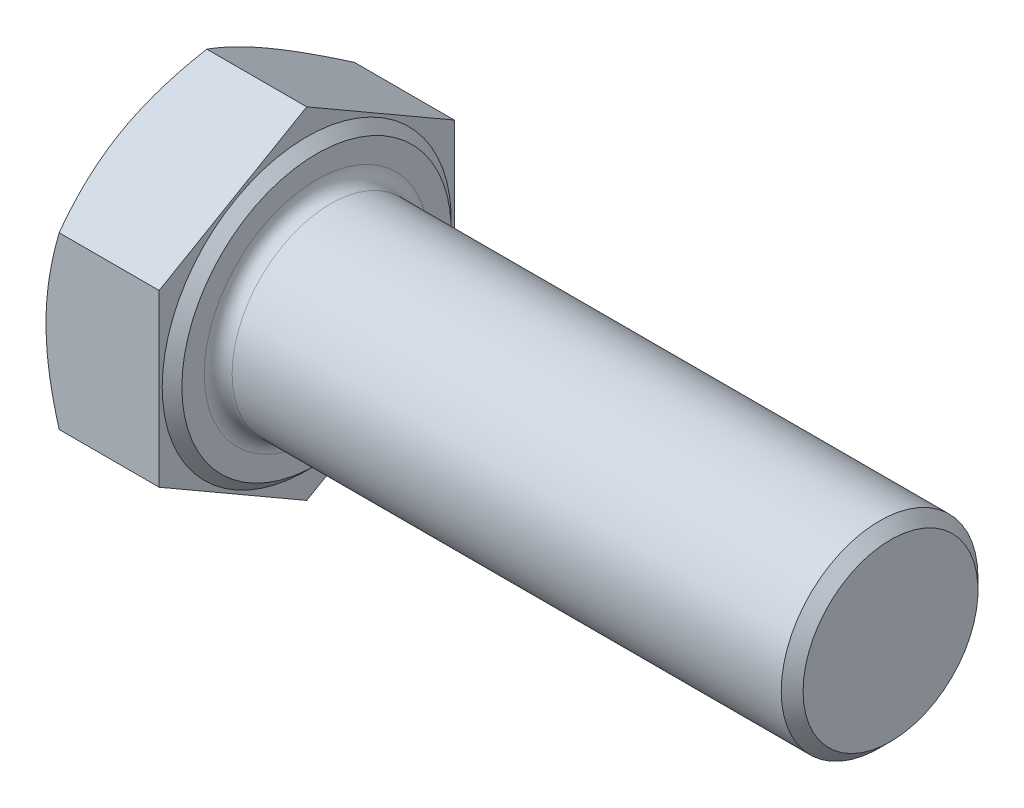
ISO-10303-21;
HEADER;
FILE_DESCRIPTION(('STEP AP214'),'2;1');
FILE_NAME('part.step','',(''),(''),'','','');
FILE_SCHEMA(('AUTOMOTIVE_DESIGN { 1 0 10303 214 1 1 1 1 }'));
ENDSEC;
DATA;
#1=APPLICATION_CONTEXT('core data for automotive mechanical design processes');
#2=APPLICATION_PROTOCOL_DEFINITION('international standard','automotive_design',2000,#1);
#3=PRODUCT_CONTEXT('',#1,'mechanical');
#4=PRODUCT('Part','Part','',(#3));
#5=PRODUCT_RELATED_PRODUCT_CATEGORY('part','',(#4));
#6=PRODUCT_DEFINITION_FORMATION('','',#4);
#7=PRODUCT_DEFINITION_CONTEXT('part definition',#1,'design');
#8=PRODUCT_DEFINITION('design','',#6,#7);
#9=PRODUCT_DEFINITION_SHAPE('','',#8);
#10=(LENGTH_UNIT() NAMED_UNIT(*) SI_UNIT(.MILLI.,.METRE.));
#11=(NAMED_UNIT(*) PLANE_ANGLE_UNIT() SI_UNIT($,.RADIAN.));
#12=(NAMED_UNIT(*) SI_UNIT($,.STERADIAN.) SOLID_ANGLE_UNIT());
#13=UNCERTAINTY_MEASURE_WITH_UNIT(LENGTH_MEASURE(1.E-05),#10,'distance_accuracy_value','');
#14=(GEOMETRIC_REPRESENTATION_CONTEXT(3) GLOBAL_UNCERTAINTY_ASSIGNED_CONTEXT((#13)) GLOBAL_UNIT_ASSIGNED_CONTEXT((#10,
#11,#12)) REPRESENTATION_CONTEXT('',''));
#15=CARTESIAN_POINT('',(0.,0.,0.));
#16=DIRECTION('',(0.,0.,1.));
#17=DIRECTION('',(1.,0.,0.));
#18=AXIS2_PLACEMENT_3D('',#15,#16,#17);
#19=CARTESIAN_POINT('',(7.50000000000001,5.19615242270663,-9.00000000000006));
#20=DIRECTION('',(1.,0.,0.));
#21=DIRECTION('',(0.,0.,-1.));
#22=AXIS2_PLACEMENT_3D('',#19,#20,#21);
#23=PLANE('',#22);
#24=CARTESIAN_POINT('',(7.50000000000001,0.,0.));
#25=DIRECTION('',(-1.,0.,0.));
#26=DIRECTION('',(0.,0.,1.));
#27=AXIS2_PLACEMENT_3D('',#24,#25,#26);
#28=CIRCLE('',#27,6.85);
#29=CARTESIAN_POINT('',(7.50000000000001,0.,6.85));
#30=VERTEX_POINT('',#29);
#31=EDGE_CURVE('E174',#30,#30,#28,.T.);
#32=ORIENTED_EDGE('',*,*,#31,.T.);
#33=EDGE_LOOP('',(#32));
#34=FACE_BOUND('',#33,.T.);
#35=CARTESIAN_POINT('',(7.50000000000001,0.,0.));
#36=DIRECTION('',(-1.,0.,0.));
#37=DIRECTION('',(0.,0.,1.));
#38=AXIS2_PLACEMENT_3D('',#35,#36,#37);
#39=CIRCLE('',#38,8.215);
#40=CARTESIAN_POINT('',(7.50000000000001,0.,8.215));
#41=VERTEX_POINT('',#40);
#42=EDGE_CURVE('E255',#41,#41,#39,.T.);
#43=ORIENTED_EDGE('',*,*,#42,.F.);
#44=EDGE_LOOP('',(#43));
#45=FACE_BOUND('',#44,.T.);
#46=ADVANCED_FACE('F38',(#34,#45),#23,.T.);
#47=CARTESIAN_POINT('',(8.35000000000002,0.,0.));
#48=DIRECTION('',(-1.,0.,0.));
#49=DIRECTION('',(0.,0.,1.));
#50=AXIS2_PLACEMENT_3D('',#47,#48,#49);
#51=TOROIDAL_SURFACE('',#50,6.85,0.85);
#52=ORIENTED_EDGE('',*,*,#31,.F.);
#53=EDGE_LOOP('',(#52));
#54=FACE_BOUND('',#53,.T.);
#55=CARTESIAN_POINT('',(8.35000000000002,0.,0.));
#56=DIRECTION('',(-1.,0.,0.));
#57=DIRECTION('',(0.,0.,1.));
#58=AXIS2_PLACEMENT_3D('',#55,#56,#57);
#59=CIRCLE('',#58,6.);
#60=CARTESIAN_POINT('',(8.35000000000002,0.,6.));
#61=VERTEX_POINT('',#60);
#62=EDGE_CURVE('E122',#61,#61,#59,.T.);
#63=ORIENTED_EDGE('',*,*,#62,.T.);
#64=EDGE_LOOP('',(#63));
#65=FACE_BOUND('',#64,.T.);
#66=ADVANCED_FACE('F209',(#54,#65),#51,.F.);
#67=CARTESIAN_POINT('',(42.5,5.99999999999998,0.));
#68=DIRECTION('',(-1.,0.,0.));
#69=DIRECTION('',(0.,0.,1.));
#70=AXIS2_PLACEMENT_3D('',#67,#68,#69);
#71=PLANE('',#70);
#72=CARTESIAN_POINT('',(42.5,0.,0.));
#73=DIRECTION('',(-1.,0.,0.));
#74=DIRECTION('',(0.,0.,1.));
#75=AXIS2_PLACEMENT_3D('',#72,#73,#74);
#76=CIRCLE('',#75,5.33333333333332);
#77=CARTESIAN_POINT('',(42.5,0.,5.33333333333331));
#78=VERTEX_POINT('',#77);
#79=EDGE_CURVE('E46',#78,#78,#76,.F.);
#80=ORIENTED_EDGE('',*,*,#79,.T.);
#81=EDGE_LOOP('',(#80));
#82=FACE_BOUND('',#81,.T.);
#83=ADVANCED_FACE('F161',(#82),#71,.F.);
#84=CARTESIAN_POINT('',(7.50000000000001,0.,0.));
#85=DIRECTION('',(-1.,0.,0.));
#86=DIRECTION('',(0.,0.,1.));
#87=AXIS2_PLACEMENT_3D('',#84,#85,#86);
#88=CYLINDRICAL_SURFACE('',#87,6.);
#89=CARTESIAN_POINT('',(41.8333333333333,0.,0.));
#90=DIRECTION('',(-1.,0.,0.));
#91=DIRECTION('',(0.,0.,1.));
#92=AXIS2_PLACEMENT_3D('',#89,#90,#91);
#93=CIRCLE('',#92,6.);
#94=CARTESIAN_POINT('',(41.8333333333333,0.,6.));
#95=VERTEX_POINT('',#94);
#96=EDGE_CURVE('E156',#95,#95,#93,.T.);
#97=ORIENTED_EDGE('',*,*,#96,.T.);
#98=EDGE_LOOP('',(#97));
#99=FACE_BOUND('',#98,.T.);
#100=ORIENTED_EDGE('',*,*,#62,.F.);
#101=EDGE_LOOP('',(#100));
#102=FACE_BOUND('',#101,.T.);
#103=ADVANCED_FACE('F165',(#99,#102),#88,.T.);
#104=CARTESIAN_POINT('',(41.8333333333333,0.,0.));
#105=DIRECTION('',(-1.,0.,0.));
#106=DIRECTION('',(0.,0.,1.));
#107=AXIS2_PLACEMENT_3D('',#104,#105,#106);
#108=CONICAL_SURFACE('',#107,6.,0.785398163397443);
#109=ORIENTED_EDGE('',*,*,#79,.F.);
#110=EDGE_LOOP('',(#109));
#111=FACE_BOUND('',#110,.T.);
#112=ORIENTED_EDGE('',*,*,#96,.F.);
#113=EDGE_LOOP('',(#112));
#114=FACE_BOUND('',#113,.T.);
#115=ADVANCED_FACE('F40',(#111,#114),#108,.T.);
#116=CARTESIAN_POINT('',(6.90000000000002,-8.81499999999999,0.));
#117=DIRECTION('',(1.,0.,0.));
#118=DIRECTION('',(0.,0.,-1.));
#119=AXIS2_PLACEMENT_3D('',#116,#117,#118);
#120=PLANE('',#119);
#121=CARTESIAN_POINT('',(6.90000000000002,0.,0.));
#122=DIRECTION('',(-1.,0.,0.));
#123=DIRECTION('',(0.,0.,1.));
#124=AXIS2_PLACEMENT_3D('',#121,#122,#123);
#125=CIRCLE('',#124,8.815);
#126=CARTESIAN_POINT('',(6.90000000000002,0.,8.81499999999999));
#127=VERTEX_POINT('',#126);
#128=EDGE_CURVE('E257',#127,#127,#125,.T.);
#129=ORIENTED_EDGE('',*,*,#128,.T.);
#130=EDGE_LOOP('',(#129));
#131=FACE_BOUND('',#130,.T.);
#132=DIRECTION('',(0.,1.,0.));
#133=VECTOR('',#132,1.);
#134=CARTESIAN_POINT('',(6.90000000000002,-5.19615242270666,-9.00000000000004));
#135=LINE('',#134,#133);
#136=CARTESIAN_POINT('',(6.90000000000002,-5.19615242270666,-9.00000000000004));
#137=VERTEX_POINT('',#136);
#138=CARTESIAN_POINT('',(6.90000000000002,5.19615242270663,-9.00000000000006));
#139=VERTEX_POINT('',#138);
#140=EDGE_CURVE('E109',#137,#139,#135,.T.);
#141=ORIENTED_EDGE('',*,*,#140,.T.);
#142=DIRECTION('',(0.,0.500000000000001,0.866025403784438));
#143=VECTOR('',#142,1.);
#144=CARTESIAN_POINT('',(6.90000000000002,5.19615242270663,-9.00000000000006));
#145=LINE('',#144,#143);
#146=CARTESIAN_POINT('',(6.90000000000002,10.3923048454135,0.));
#147=VERTEX_POINT('',#146);
#148=EDGE_CURVE('E123',#139,#147,#145,.T.);
#149=ORIENTED_EDGE('',*,*,#148,.T.);
#150=DIRECTION('',(0.,-0.5,0.866025403784439));
#151=VECTOR('',#150,1.);
#152=CARTESIAN_POINT('',(6.90000000000002,10.3923048454135,0.));
#153=LINE('',#152,#151);
#154=CARTESIAN_POINT('',(6.90000000000002,5.19615242270663,9.00000000000008));
#155=VERTEX_POINT('',#154);
#156=EDGE_CURVE('E265',#147,#155,#153,.T.);
#157=ORIENTED_EDGE('',*,*,#156,.T.);
#158=DIRECTION('',(0.,-1.,0.));
#159=VECTOR('',#158,1.);
#160=CARTESIAN_POINT('',(6.90000000000002,5.19615242270663,9.00000000000008));
#161=LINE('',#160,#159);
#162=CARTESIAN_POINT('',(6.90000000000002,-5.19615242270663,9.00000000000001));
#163=VERTEX_POINT('',#162);
#164=EDGE_CURVE('E263',#155,#163,#161,.T.);
#165=ORIENTED_EDGE('',*,*,#164,.T.);
#166=DIRECTION('',(0.,-0.500000000000001,-0.866025403784438));
#167=VECTOR('',#166,1.);
#168=CARTESIAN_POINT('',(6.90000000000002,-5.19615242270663,9.00000000000001));
#169=LINE('',#168,#167);
#170=CARTESIAN_POINT('',(6.90000000000002,-10.3923048454131,0.));
#171=VERTEX_POINT('',#170);
#172=EDGE_CURVE('E52',#163,#171,#169,.T.);
#173=ORIENTED_EDGE('',*,*,#172,.T.);
#174=DIRECTION('',(0.,0.499999999999999,-0.86602540378444));
#175=VECTOR('',#174,1.);
#176=CARTESIAN_POINT('',(6.90000000000002,-10.3923048454131,0.));
#177=LINE('',#176,#175);
#178=EDGE_CURVE('E11',#171,#137,#177,.T.);
#179=ORIENTED_EDGE('',*,*,#178,.T.);
#180=EDGE_LOOP('',(#141,#149,#157,#165,#173,#179));
#181=FACE_BOUND('',#180,.T.);
#182=ADVANCED_FACE('F108',(#131,#181),#120,.T.);
#183=CARTESIAN_POINT('',(6.90000000000002,0.,0.));
#184=DIRECTION('',(-1.,0.,0.));
#185=DIRECTION('',(0.,0.,1.));
#186=AXIS2_PLACEMENT_3D('',#183,#184,#185);
#187=CONICAL_SURFACE('',#186,8.815,0.785398163397445);
#188=ORIENTED_EDGE('',*,*,#42,.T.);
#189=EDGE_LOOP('',(#188));
#190=FACE_BOUND('',#189,.T.);
#191=ORIENTED_EDGE('',*,*,#128,.F.);
#192=EDGE_LOOP('',(#191));
#193=FACE_BOUND('',#192,.T.);
#194=ADVANCED_FACE('F329',(#190,#193),#187,.T.);
#195=CARTESIAN_POINT('',(0.,5.19615242270663,-9.00000000000006));
#196=DIRECTION('',(1.,0.,0.));
#197=DIRECTION('',(0.,0.,-1.));
#198=AXIS2_PLACEMENT_3D('',#195,#196,#197);
#199=PLANE('',#198);
#200=CARTESIAN_POINT('',(0.,0.,0.));
#201=DIRECTION('',(1.,0.,0.));
#202=DIRECTION('',(0.,0.,-1.));
#203=AXIS2_PLACEMENT_3D('',#200,#201,#202);
#204=CIRCLE('',#203,9.);
#205=CARTESIAN_POINT('',(0.,0.,-8.99999999999998));
#206=VERTEX_POINT('',#205);
#207=CARTESIAN_POINT('',(0.,7.79422863405993,-4.5));
#208=VERTEX_POINT('',#207);
#209=EDGE_CURVE('E155',#206,#208,#204,.T.);
#210=ORIENTED_EDGE('',*,*,#209,.F.);
#211=CARTESIAN_POINT('',(0.,-7.79422863405982,-4.49999999999998));
#212=VERTEX_POINT('',#211);
#213=EDGE_CURVE('E151',#212,#206,#204,.T.);
#214=ORIENTED_EDGE('',*,*,#213,.F.);
#215=CARTESIAN_POINT('',(0.,-7.79422863405993,4.50000000000006));
#216=VERTEX_POINT('',#215);
#217=EDGE_CURVE('E154',#216,#212,#204,.T.);
#218=ORIENTED_EDGE('',*,*,#217,.F.);
#219=CARTESIAN_POINT('',(0.,0.,9.00000000000001));
#220=VERTEX_POINT('',#219);
#221=EDGE_CURVE('E294',#220,#216,#204,.T.);
#222=ORIENTED_EDGE('',*,*,#221,.F.);
#223=CARTESIAN_POINT('',(0.,0.,0.));
#224=DIRECTION('',(-1.,0.,0.));
#225=DIRECTION('',(0.,0.,1.));
#226=AXIS2_PLACEMENT_3D('',#223,#224,#225);
#227=CIRCLE('',#226,9.);
#228=CARTESIAN_POINT('',(0.,7.79422863405996,4.49999999999999));
#229=VERTEX_POINT('',#228);
#230=EDGE_CURVE('E177',#220,#229,#227,.T.);
#231=ORIENTED_EDGE('',*,*,#230,.T.);
#232=EDGE_CURVE('E331',#208,#229,#204,.T.);
#233=ORIENTED_EDGE('',*,*,#232,.F.);
#234=EDGE_LOOP('',(#210,#214,#218,#222,#231,#233));
#235=FACE_BOUND('',#234,.T.);
#236=ADVANCED_FACE('F323',(#235),#199,.F.);
#237=CARTESIAN_POINT('',(0.,0.,0.));
#238=DIRECTION('',(1.,0.,0.));
#239=DIRECTION('',(0.,0.,1.));
#240=AXIS2_PLACEMENT_3D('',#237,#238,#239);
#241=CONICAL_SURFACE('',#240,9.,1.0471975511966);
#242=CARTESIAN_POINT('',(0.803914245071147,10.3924203154671,0.000199999999977996));
#243=CARTESIAN_POINT('',(0.737982001874065,10.2782163639798,-0.197607046401242));
#244=CARTESIAN_POINT('',(0.675041409210321,10.1635669787649,-0.396185606649972));
#245=CARTESIAN_POINT('',(0.555968997655546,9.93333715083392,-0.794955366044238));
#246=CARTESIAN_POINT('',(0.499840117752073,9.8177563290131,-0.995147221818479));
#247=CARTESIAN_POINT('',(0.395151960728974,9.5854491510023,-1.39751505709613));
#248=CARTESIAN_POINT('',(0.346610772912798,9.46872074181188,-1.59969459250062));
#249=CARTESIAN_POINT('',(0.258148516787933,9.23447001335915,-2.00542875589077));
#250=CARTESIAN_POINT('',(0.218225687483287,9.11694786135376,-2.20898309417894));
#251=CARTESIAN_POINT('',(0.148684674147128,8.88408932604664,-2.61230590830694));
#252=CARTESIAN_POINT('',(0.118837502847814,8.76877014301849,-2.81204459239903));
#253=CARTESIAN_POINT('',(0.0687933098590968,8.53761579013207,-3.21241567598902));
#254=CARTESIAN_POINT('',(0.0485954355375556,8.42178066677664,-3.41304799494163));
#255=CARTESIAN_POINT('',(0.0183543473973625,8.18990950036673,-3.81466063597384));
#256=CARTESIAN_POINT('',(0.00829960958431743,8.07387383570155,-4.01564030266396));
#257=CARTESIAN_POINT('',(-0.00143766485489935,7.84169571742975,-4.41778459991644));
#258=CARTESIAN_POINT('',(-0.00112052193522018,7.72555326723329,-4.61894922457224));
#259=CARTESIAN_POINT('',(0.00916395215319622,7.50842142195783,-4.99503261253052));
#260=CARTESIAN_POINT('',(0.0178767400304155,7.40741671639996,-5.16997789436031));
#261=CARTESIAN_POINT('',(0.0429773400653847,7.20564389241821,-5.51945867708337));
#262=CARTESIAN_POINT('',(0.0593656695806853,7.10487579040242,-5.69399414955699));
#263=CARTESIAN_POINT('',(0.119656556235847,6.80296159398082,-6.21692487728552));
#264=CARTESIAN_POINT('',(0.174677482341145,6.60234990505057,-6.56439451510493));
#265=CARTESIAN_POINT('',(0.312230476325164,6.19899850762264,-7.263019628754));
#266=CARTESIAN_POINT('',(0.395345618627118,5.99631027619255,-7.61408594368717));
#267=CARTESIAN_POINT('',(0.583982539436472,5.59395639760768,-8.31098330401861));
#268=CARTESIAN_POINT('',(0.689460012893368,5.39428559809861,-8.6568232735563));
#269=CARTESIAN_POINT('',(0.803914245071147,5.19603695265294,-9.00020000000005));
#270=B_SPLINE_CURVE_WITH_KNOTS('',3,(#242,#243,#244,#245,#246,#247,#248,#249,#250,#251,#252,
#253,#254,#255,#256,#257,#258,#259,#260,#261,#262,#263,#264,#265,#266,#267,#268,#269),
.UNSPECIFIED.,.F.,.F.,(4,2,2,2,2,2,2,2,2,2,2,2,2,4),(0.,0.713219249102578,1.42674513853509,
2.14194697262263,2.8570025303448,3.55449749123034,4.25193080859214,4.94857085059645,
5.64518936892662,6.25162976378283,6.85811104066339,8.07193747617892,9.31268391793538,
10.5509947443907),.UNSPECIFIED.);
#271=CARTESIAN_POINT('',(0.803847577293404,5.19615242270663,-9.00000000000006));
#272=VERTEX_POINT('',#271);
#273=EDGE_CURVE('E228',#208,#272,#270,.T.);
#274=ORIENTED_EDGE('',*,*,#273,.T.);
#275=CARTESIAN_POINT('',(4.31570741919823,-13.7995084316842,-9.00000000000001));
#276=CARTESIAN_POINT('',(4.22013253439525,-13.6018679254425,-9.00000000000001));
#277=CARTESIAN_POINT('',(4.12505080298439,-13.4039890546483,-9.00000000000002));
#278=CARTESIAN_POINT('',(3.93598680428887,-13.0077042464044,-9.00000000000002));
#279=CARTESIAN_POINT('',(3.84200454898892,-12.8092983032383,-9.00000000000002));
#280=CARTESIAN_POINT('',(3.5618496278038,-12.2131565216175,-9.00000000000002));
#281=CARTESIAN_POINT('',(3.37749981033898,-11.8145606598044,-9.00000000000002));
#282=CARTESIAN_POINT('',(3.01379661311231,-11.0123492685396,-9.00000000000002));
#283=CARTESIAN_POINT('',(2.83447768874727,-10.60871807829,-9.00000000000002));
#284=CARTESIAN_POINT('',(2.48351230837532,-9.7981457700355,-9.00000000000002));
#285=CARTESIAN_POINT('',(2.31186545400592,-9.39120482518524,-9.00000000000002));
#286=CARTESIAN_POINT('',(1.97621528218628,-8.56822658898822,-9.00000000000003));
#287=CARTESIAN_POINT('',(1.812334205178,-8.1521391667201,-9.00000000000003));
#288=CARTESIAN_POINT('',(1.49736059333086,-7.31506428892373,-9.00000000000003));
#289=CARTESIAN_POINT('',(1.34626947902359,-6.89407629499918,-9.00000000000003));
#290=CARTESIAN_POINT('',(1.06092289616766,-6.0473837446527,-9.00000000000003));
#291=CARTESIAN_POINT('',(0.926631795715656,-5.6216913287965,-9.00000000000004));
#292=CARTESIAN_POINT('',(0.679232315760684,-4.76426914600713,-9.00000000000004));
#293=CARTESIAN_POINT('',(0.566117256449562,-4.33254132922886,-9.00000000000004));
#294=CARTESIAN_POINT('',(0.366559377115355,-3.46268902797103,-9.00000000000004));
#295=CARTESIAN_POINT('',(0.280122671254125,-3.02456310122819,-9.00000000000004));
#296=CARTESIAN_POINT('',(0.174793560541798,-2.36350316664861,-9.00000000000004));
#297=CARTESIAN_POINT('',(0.143735891512449,-2.14247764841093,-9.00000000000004));
#298=CARTESIAN_POINT('',(0.0903399537533651,-1.69938384805884,-9.00000000000004));
#299=CARTESIAN_POINT('',(0.0680008209790217,-1.47731567148503,-9.00000000000004));
#300=CARTESIAN_POINT('',(0.0326440618616513,-1.03385615589214,-9.00000000000004));
#301=CARTESIAN_POINT('',(0.0195680807765826,-0.812469488475584,-9.00000000000004));
#302=CARTESIAN_POINT('',(0.00280703600107451,-0.369341048257067,-9.00000000000004));
#303=CARTESIAN_POINT('',(-0.000878151660731526,-0.14759928018159,-9.00000000000004));
#304=CARTESIAN_POINT('',(0.00123027624062916,0.295777195751568,-9.00000000000005));
#305=CARTESIAN_POINT('',(0.00702120862286194,0.517411916146314,-9.00000000000007));
#306=CARTESIAN_POINT('',(0.0279373459487407,0.96024367324103,-9.00000000000003));
#307=CARTESIAN_POINT('',(0.0430630239652033,1.18144068718861,-8.99999999999998));
#308=CARTESIAN_POINT('',(0.0906660893200693,1.71695975867402,-8.99999999999995));
#309=CARTESIAN_POINT('',(0.12778731642352,2.03087581677058,-9.00000000000002));
#310=CARTESIAN_POINT('',(0.218774280130734,2.65631496671329,-9.00000000000008));
#311=CARTESIAN_POINT('',(0.272644573172971,2.96783738373068,-9.00000000000006));
#312=CARTESIAN_POINT('',(0.395219259557985,3.58822803653589,-9.00000000000005));
#313=CARTESIAN_POINT('',(0.463937632650095,3.89709348380475,-9.00000000000005));
#314=CARTESIAN_POINT('',(0.61411073317504,4.51165246111977,-9.00000000000006));
#315=CARTESIAN_POINT('',(0.695564262982188,4.81734628654847,-9.00000000000006));
#316=CARTESIAN_POINT('',(0.871394352716642,5.43311669104543,-9.00000000000006));
#317=CARTESIAN_POINT('',(0.96603958672981,5.74311602048134,-9.00000000000006));
#318=CARTESIAN_POINT('',(1.16472102284557,6.35983838148379,-9.00000000000006));
#319=CARTESIAN_POINT('',(1.26875076248441,6.66656350743346,-9.00000000000006));
#320=CARTESIAN_POINT('',(1.48404906939522,7.27550705154958,-9.00000000000006));
#321=CARTESIAN_POINT('',(1.59527366551674,7.57774111009053,-9.00000000000007));
#322=CARTESIAN_POINT('',(1.82427658147781,8.17986095918037,-9.00000000000006));
#323=CARTESIAN_POINT('',(1.94205753444503,8.47974575026484,-9.00000000000004));
#324=CARTESIAN_POINT('',(2.06246896276846,8.77853935760564,-9.00000000000001));
#325=B_SPLINE_CURVE_WITH_KNOTS('',3,(#275,#276,#277,#278,#279,#280,#281,#282,#283,#284,#285,
#286,#287,#288,#289,#290,#291,#292,#293,#294,#295,#296,#297,#298,#299,#300,#301,#302,#303,#304,
#305,#306,#307,#308,#309,#310,#311,#312,#313,#314,#315,#316,#317,#318,#319,#320,#321,#322,#323,
#324),.UNSPECIFIED.,.F.,.F.,(4,2,2,2,2,2,2,2,2,2,2,2,2,2,2,2,2,2,2,2,2,2,2,2,4),(0.,
0.658608595642925,1.31722436368955,2.63466903722825,3.95962057950497,5.28450324524444,
6.62593322236614,7.96751199196902,9.30619528594496,10.6444555891148,11.9830223682757,
12.6524681090956,13.3218474880933,13.9869715718367,14.6520868749834,15.3170138820863,
15.9819745895962,16.929756693784,17.877796859826,18.8267335436614,19.7755810422467,
20.747776571344,21.719307653667,22.6853783589894,23.6518398914796),.UNSPECIFIED.);
#326=EDGE_CURVE('E283',#272,#206,#325,.F.);
#327=ORIENTED_EDGE('',*,*,#326,.T.);
#328=ORIENTED_EDGE('',*,*,#209,.T.);
#329=EDGE_LOOP('',(#274,#327,#328));
#330=FACE_BOUND('',#329,.T.);
#331=ADVANCED_FACE('F319',(#330),#241,.T.);
#332=CARTESIAN_POINT('',(0.803914245071147,5.19603695265283,9.00020000000001));
#333=CARTESIAN_POINT('',(0.737982001874108,5.31024090414026,8.80239295359883));
#334=CARTESIAN_POINT('',(0.675041409210383,5.42489028935518,8.60381439335011));
#335=CARTESIAN_POINT('',(0.55596899765562,5.65512011728617,8.20504463395586));
#336=CARTESIAN_POINT('',(0.499840117752142,5.77070093910699,8.00485277818161));
#337=CARTESIAN_POINT('',(0.395151960729039,6.00300811711778,7.60248494290395));
#338=CARTESIAN_POINT('',(0.346610772912865,6.11973652630821,7.40030540749945));
#339=CARTESIAN_POINT('',(0.258148516788,6.35398725476094,6.99457124410929));
#340=CARTESIAN_POINT('',(0.218225687483353,6.47150940676633,6.79101690582112));
#341=CARTESIAN_POINT('',(0.148684674147195,6.70436794207346,6.38769409169311));
#342=CARTESIAN_POINT('',(0.118837502847883,6.81968712510161,6.18795540760102));
#343=CARTESIAN_POINT('',(0.0687933098591638,7.05084147798803,5.78758432401102));
#344=CARTESIAN_POINT('',(0.048595435537619,7.16667660134346,5.58695200505841));
#345=CARTESIAN_POINT('',(0.0183543473974392,7.39854776775337,5.18533936402619));
#346=CARTESIAN_POINT('',(0.00829960958441096,7.51458343241855,4.98435969733607));
#347=CARTESIAN_POINT('',(-0.00143766485484689,7.74676155069034,4.58221540008358));
#348=CARTESIAN_POINT('',(-0.0011205219352257,7.86290400088679,4.38105077542777));
#349=CARTESIAN_POINT('',(0.0091639521532009,8.08003584616225,4.00496738746949));
#350=CARTESIAN_POINT('',(0.0178767400304727,8.18104055172014,3.83002210563972));
#351=CARTESIAN_POINT('',(0.0429773400654822,8.38281337570189,3.48054132291667));
#352=CARTESIAN_POINT('',(0.0593656695807704,8.48358147771767,3.30600585044305));
#353=CARTESIAN_POINT('',(0.119656556235911,8.78549567413926,2.78307512271452));
#354=CARTESIAN_POINT('',(0.174677482341217,8.98610736306952,2.43560548489512));
#355=CARTESIAN_POINT('',(0.312230476325247,9.38945876049745,1.73698037124604));
#356=CARTESIAN_POINT('',(0.395345618627203,9.59214699192753,1.38591405631288));
#357=CARTESIAN_POINT('',(0.583982539436537,9.99450087051239,0.689016695981442));
#358=CARTESIAN_POINT('',(0.689460012893411,10.1941716700215,0.343176726443752));
#359=CARTESIAN_POINT('',(0.803914245071147,10.3924203154671,-0.000200000000019629));
#360=B_SPLINE_CURVE_WITH_KNOTS('',3,(#332,#333,#334,#335,#336,#337,#338,#339,#340,#341,#342,
#343,#344,#345,#346,#347,#348,#349,#350,#351,#352,#353,#354,#355,#356,#357,#358,#359),
.UNSPECIFIED.,.F.,.F.,(4,2,2,2,2,2,2,2,2,2,2,2,2,4),(0.,0.713219249102579,1.4267451385351,
2.14194697262265,2.85700253034484,3.55449749123039,4.2519308085922,4.94857085059651,
5.64518936892669,6.25162976378289,6.85811104066345,8.07193747617896,9.31268391793542,
10.5509947443907),.UNSPECIFIED.);
#361=CARTESIAN_POINT('',(0.803847577293348,10.3923048454135,0.));
#362=VERTEX_POINT('',#361);
#363=EDGE_CURVE('E135',#229,#362,#360,.T.);
#364=ORIENTED_EDGE('',*,*,#363,.T.);
#365=EDGE_CURVE('E60',#362,#208,#270,.T.);
#366=ORIENTED_EDGE('',*,*,#365,.T.);
#367=ORIENTED_EDGE('',*,*,#232,.T.);
#368=EDGE_LOOP('',(#364,#366,#367));
#369=FACE_BOUND('',#368,.T.);
#370=ADVANCED_FACE('F206',(#369),#241,.T.);
#371=CARTESIAN_POINT('',(0.803847577293348,5.19615242270663,9.00000000000008));
#372=VERTEX_POINT('',#371);
#373=EDGE_CURVE('E131',#372,#229,#360,.T.);
#374=ORIENTED_EDGE('',*,*,#373,.T.);
#375=ORIENTED_EDGE('',*,*,#230,.F.);
#376=CARTESIAN_POINT('',(4.31570741919818,-13.7995084316843,9.00000000000001));
#377=CARTESIAN_POINT('',(4.22013253439525,-13.6018679254426,9.00000000000007));
#378=CARTESIAN_POINT('',(4.12505080298442,-13.4039890546483,9.00000000000009));
#379=CARTESIAN_POINT('',(3.93598680428893,-13.0077042464044,9.00000000000011));
#380=CARTESIAN_POINT('',(3.84200454898897,-12.8092983032383,9.0000000000001));
#381=CARTESIAN_POINT('',(3.56184962780384,-12.2131565216176,9.00000000000009));
#382=CARTESIAN_POINT('',(3.37749981033902,-11.8145606598044,9.0000000000001));
#383=CARTESIAN_POINT('',(3.01379661311236,-11.0123492685396,9.0000000000001));
#384=CARTESIAN_POINT('',(2.83447768874731,-10.6087180782901,9.0000000000001));
#385=CARTESIAN_POINT('',(2.48351230837536,-9.79814577003553,9.0000000000001));
#386=CARTESIAN_POINT('',(2.31186545400596,-9.39120482518527,9.0000000000001));
#387=CARTESIAN_POINT('',(1.97621528218631,-8.56822658898823,9.0000000000001));
#388=CARTESIAN_POINT('',(1.81233420517803,-8.15213916672011,9.0000000000001));
#389=CARTESIAN_POINT('',(1.49736059333089,-7.31506428892373,9.00000000000009));
#390=CARTESIAN_POINT('',(1.34626947902361,-6.89407629499918,9.00000000000009));
#391=CARTESIAN_POINT('',(1.06092289616768,-6.04738374465269,9.0000000000001));
#392=CARTESIAN_POINT('',(0.926631795715682,-5.62169132879648,9.00000000000012));
#393=CARTESIAN_POINT('',(0.679232315760699,-4.76426914600711,9.00000000000007));
#394=CARTESIAN_POINT('',(0.566117256449562,-4.33254132922883,9.00000000000001));
#395=CARTESIAN_POINT('',(0.366559377115357,-3.462689027971,9.00000000000001));
#396=CARTESIAN_POINT('',(0.280122671254141,-3.02456310122817,9.00000000000007));
#397=CARTESIAN_POINT('',(0.174793560541822,-2.36350316664859,9.00000000000009));
#398=CARTESIAN_POINT('',(0.143735891512472,-2.14247764841091,9.00000000000009));
#399=CARTESIAN_POINT('',(0.0903399537533873,-1.69938384805882,9.00000000000009));
#400=CARTESIAN_POINT('',(0.0680008209790429,-1.47731567148501,9.00000000000009));
#401=CARTESIAN_POINT('',(0.032644061861673,-1.03385615589212,9.00000000000009));
#402=CARTESIAN_POINT('',(0.0195680807766056,-0.812469488475572,9.00000000000009));
#403=CARTESIAN_POINT('',(0.00280703600109555,-0.369341048257057,9.00000000000008));
#404=CARTESIAN_POINT('',(-0.000878151660713623,-0.14759928018158,9.00000000000008));
#405=CARTESIAN_POINT('',(0.0012302762406546,0.295777195751574,9.00000000000009));
#406=CARTESIAN_POINT('',(0.00702120862289799,0.517411916146318,9.0000000000001));
#407=CARTESIAN_POINT('',(0.0279373459487411,0.960243673241032,9.00000000000006));
#408=CARTESIAN_POINT('',(0.0430630239651574,1.18144068718861,9.00000000000001));
#409=CARTESIAN_POINT('',(0.0906660893199996,1.71695975867401,8.99999999999998));
#410=CARTESIAN_POINT('',(0.127787316423511,2.03087581677056,9.00000000000006));
#411=CARTESIAN_POINT('',(0.218774280130765,2.65631496671325,9.00000000000011));
#412=CARTESIAN_POINT('',(0.272644573172982,2.96783738373063,9.00000000000009));
#413=CARTESIAN_POINT('',(0.395219259557977,3.58822803653583,9.00000000000007));
#414=CARTESIAN_POINT('',(0.463937632650089,3.89709348380468,9.00000000000008));
#415=CARTESIAN_POINT('',(0.614110733175031,4.51165246111969,9.00000000000008));
#416=CARTESIAN_POINT('',(0.695564262982174,4.81734628654838,9.00000000000008));
#417=CARTESIAN_POINT('',(0.871394352716621,5.43311669104533,9.00000000000008));
#418=CARTESIAN_POINT('',(0.966039586729786,5.74311602048123,9.00000000000008));
#419=CARTESIAN_POINT('',(1.16472102284554,6.35983838148368,9.00000000000008));
#420=CARTESIAN_POINT('',(1.26875076248438,6.66656350743335,9.00000000000007));
#421=CARTESIAN_POINT('',(1.48404906939518,7.27550705154945,9.00000000000008));
#422=CARTESIAN_POINT('',(1.59527366551669,7.57774111009039,9.00000000000008));
#423=CARTESIAN_POINT('',(1.82427658147775,8.17986095918022,9.00000000000007));
#424=CARTESIAN_POINT('',(1.94205753444497,8.47974575026469,9.00000000000004));
#425=CARTESIAN_POINT('',(2.0624689627684,8.77853935760547,8.99999999999998));
#426=B_SPLINE_CURVE_WITH_KNOTS('',3,(#376,#377,#378,#379,#380,#381,#382,#383,#384,#385,#386,
#387,#388,#389,#390,#391,#392,#393,#394,#395,#396,#397,#398,#399,#400,#401,#402,#403,#404,#405,
#406,#407,#408,#409,#410,#411,#412,#413,#414,#415,#416,#417,#418,#419,#420,#421,#422,#423,#424,
#425),.UNSPECIFIED.,.F.,.F.,(4,2,2,2,2,2,2,2,2,2,2,2,2,2,2,2,2,2,2,2,2,2,2,2,4),(0.,
0.658608595642924,1.31722436368956,2.63466903722825,3.95962057950498,5.28450324524446,
6.62593322236618,7.96751199196907,9.30619528594502,10.6444555891148,11.9830223682757,
12.6524681090957,13.3218474880934,13.9869715718367,14.6520868749834,15.3170138820864,
15.9819745895962,16.929756693784,17.877796859826,18.8267335436614,19.7755810422467,
20.7477765713439,21.7193076536669,22.6853783589893,23.6518398914795),.UNSPECIFIED.);
#427=EDGE_CURVE('E274',#220,#372,#426,.T.);
#428=ORIENTED_EDGE('',*,*,#427,.T.);
#429=EDGE_LOOP('',(#374,#375,#428));
#430=FACE_BOUND('',#429,.T.);
#431=ADVANCED_FACE('F200',(#430),#241,.T.);
#432=CARTESIAN_POINT('',(0.803847577293348,-5.19615242270663,9.00000000000001));
#433=VERTEX_POINT('',#432);
#434=EDGE_CURVE('E222',#433,#220,#426,.T.);
#435=ORIENTED_EDGE('',*,*,#434,.T.);
#436=ORIENTED_EDGE('',*,*,#221,.T.);
#437=CARTESIAN_POINT('',(0.803914245071147,-10.3924203154669,-0.000200000000005751));
#438=CARTESIAN_POINT('',(0.737982001874045,-10.2782163639797,0.197607046401257));
#439=CARTESIAN_POINT('',(0.675041409210295,-10.1635669787648,0.396185606650002));
#440=CARTESIAN_POINT('',(0.555968997655516,-9.93333715083389,0.794955366044275));
#441=CARTESIAN_POINT('',(0.499840117752047,-9.81775632901305,0.995147221818508));
#442=CARTESIAN_POINT('',(0.395151960728951,-9.58544915100225,1.39751505709614));
#443=CARTESIAN_POINT('',(0.346610772912775,-9.46872074181183,1.59969459250064));
#444=CARTESIAN_POINT('',(0.258148516787911,-9.23447001335911,2.00542875589079));
#445=CARTESIAN_POINT('',(0.218225687483265,-9.11694786135372,2.20898309417895));
#446=CARTESIAN_POINT('',(0.148684674147109,-8.8840893260466,2.61230590830695));
#447=CARTESIAN_POINT('',(0.118837502847797,-8.76877014301846,2.81204459239903));
#448=CARTESIAN_POINT('',(0.0687933098590792,-8.53761579013204,3.21241567598902));
#449=CARTESIAN_POINT('',(0.0485954355375356,-8.42178066677661,3.41304799494162));
#450=CARTESIAN_POINT('',(0.0183543473973485,-8.18990950036671,3.81466063597383));
#451=CARTESIAN_POINT('',(0.00829960958431178,-8.07387383570154,4.01564030266395));
#452=CARTESIAN_POINT('',(-0.00143766485492661,-7.84169571742973,4.41778459991642));
#453=CARTESIAN_POINT('',(-0.00112052193527744,-7.72555326723326,4.6189492245722));
#454=CARTESIAN_POINT('',(0.00916395215314241,-7.5084214219578,4.99503261253048));
#455=CARTESIAN_POINT('',(0.0178767400303877,-7.40741671639994,5.16997789436028));
#456=CARTESIAN_POINT('',(0.0429773400653769,-7.20564389241819,5.51945867708335));
#457=CARTESIAN_POINT('',(0.0593656695806714,-7.1048757904024,5.69399414955697));
#458=CARTESIAN_POINT('',(0.119656556235824,-6.80296159398079,6.21692487728551));
#459=CARTESIAN_POINT('',(0.174677482341128,-6.60234990505053,6.56439451510493));
#460=CARTESIAN_POINT('',(0.312230476325157,-6.1989985076226,7.26301962875402));
#461=CARTESIAN_POINT('',(0.395345618627114,-5.99631027619252,7.6140859436872));
#462=CARTESIAN_POINT('',(0.58398253943647,-5.59395639760761,8.31098330401865));
#463=CARTESIAN_POINT('',(0.689460012893367,-5.39428559809849,8.65682327355632));
#464=CARTESIAN_POINT('',(0.803914245071147,-5.19603695265272,9.00020000000003));
#465=B_SPLINE_CURVE_WITH_KNOTS('',3,(#437,#438,#439,#440,#441,#442,#443,#444,#445,#446,#447,
#448,#449,#450,#451,#452,#453,#454,#455,#456,#457,#458,#459,#460,#461,#462,#463,#464),
.UNSPECIFIED.,.F.,.F.,(4,2,2,2,2,2,2,2,2,2,2,2,2,4),(0.,0.713219249102567,1.42674513853507,
2.1419469726226,2.85700253034476,3.55449749123029,4.25193080859208,4.94857085059637,
5.64518936892653,6.25162976378275,6.85811104066333,8.07193747617888,9.31268391793538,
10.5509947443907),.UNSPECIFIED.);
#466=EDGE_CURVE('E278',#216,#433,#465,.T.);
#467=ORIENTED_EDGE('',*,*,#466,.T.);
#468=EDGE_LOOP('',(#435,#436,#467));
#469=FACE_BOUND('',#468,.T.);
#470=ADVANCED_FACE('F205',(#469),#241,.T.);
#471=CARTESIAN_POINT('',(0.803847577293404,-5.19615242270666,-9.00000000000004));
#472=VERTEX_POINT('',#471);
#473=EDGE_CURVE('E216',#206,#472,#325,.F.);
#474=ORIENTED_EDGE('',*,*,#473,.T.);
#475=CARTESIAN_POINT('',(0.803914245071147,-5.1960369526528,-9.00020000000004));
#476=CARTESIAN_POINT('',(0.737982001874029,-5.31024090414007,-8.80239295359879));
#477=CARTESIAN_POINT('',(0.675041409210268,-5.42489028935493,-8.60381439335004));
#478=CARTESIAN_POINT('',(0.555968997655477,-5.65512011728587,-8.20504463395576));
#479=CARTESIAN_POINT('',(0.499840117752005,-5.77070093910671,-8.00485277818152));
#480=CARTESIAN_POINT('',(0.395151960728904,-6.00300811711751,-7.60248494290387));
#481=CARTESIAN_POINT('',(0.346610772912726,-6.11973652630793,-7.40030540749937));
#482=CARTESIAN_POINT('',(0.258148516787858,-6.35398725476065,-6.99457124410922));
#483=CARTESIAN_POINT('',(0.218225687483211,-6.47150940676604,-6.79101690582106));
#484=CARTESIAN_POINT('',(0.148684674147048,-6.70436794207316,-6.38769409169305));
#485=CARTESIAN_POINT('',(0.118837502847731,-6.81968712510131,-6.18795540760096));
#486=CARTESIAN_POINT('',(0.0687933098590144,-7.05084147798774,-5.78758432401097));
#487=CARTESIAN_POINT('',(0.0485954355374771,-7.16667660134317,-5.58695200505836));
#488=CARTESIAN_POINT('',(0.018354347397268,-7.39854776775306,-5.18533936402613));
#489=CARTESIAN_POINT('',(0.00829960958420316,-7.51458343241822,-4.984359697336));
#490=CARTESIAN_POINT('',(-0.0014376648549634,-7.74676155069008,-4.58221540008354));
#491=CARTESIAN_POINT('',(-0.00112052193521412,-7.86290400088663,-4.38105077542779));
#492=CARTESIAN_POINT('',(0.00916395215319093,-8.08003584616208,-4.0049673874695));
#493=CARTESIAN_POINT('',(0.0178767400303472,-8.18104055171988,-3.83002210563966));
#494=CARTESIAN_POINT('',(0.0429773400652691,-8.38281337570158,-3.48054132291656));
#495=CARTESIAN_POINT('',(0.0593656695805854,-8.48358147771738,-3.30600585044295));
#496=CARTESIAN_POINT('',(0.119656556235774,-8.78549567413901,-2.78307512271443));
#497=CARTESIAN_POINT('',(0.174677482341062,-8.98610736306926,-2.43560548489502));
#498=CARTESIAN_POINT('',(0.31223047632507,-9.38945876049717,-1.73698037124592));
#499=CARTESIAN_POINT('',(0.395345618627022,-9.59214699192723,-1.38591405631274));
#500=CARTESIAN_POINT('',(0.583982539436399,-9.99450087051216,-0.689016695981334));
#501=CARTESIAN_POINT('',(0.689460012893321,-10.1941716700213,-0.343176726443686));
#502=CARTESIAN_POINT('',(0.803914245071147,-10.3924203154671,0.000199999999977996));
#503=B_SPLINE_CURVE_WITH_KNOTS('',3,(#475,#476,#477,#478,#479,#480,#481,#482,#483,#484,#485,
#486,#487,#488,#489,#490,#491,#492,#493,#494,#495,#496,#497,#498,#499,#500,#501,#502),
.UNSPECIFIED.,.F.,.F.,(4,2,2,2,2,2,2,2,2,2,2,2,2,4),(0.,0.713219249102589,1.42674513853511,
2.14194697262265,2.85700253034483,3.55449749123037,4.25193080859218,4.94857085059649,
5.64518936892668,6.25162976378289,6.85811104066346,8.071937476179,9.31268391793546,
10.5509947443908),.UNSPECIFIED.);
#504=EDGE_CURVE('E129',#472,#212,#503,.T.);
#505=ORIENTED_EDGE('',*,*,#504,.T.);
#506=ORIENTED_EDGE('',*,*,#213,.T.);
#507=EDGE_LOOP('',(#474,#505,#506));
#508=FACE_BOUND('',#507,.T.);
#509=ADVANCED_FACE('F289',(#508),#241,.T.);
#510=CARTESIAN_POINT('',(0.803847577293348,-10.3923048454131,0.));
#511=VERTEX_POINT('',#510);
#512=EDGE_CURVE('E191',#511,#216,#465,.T.);
#513=ORIENTED_EDGE('',*,*,#512,.T.);
#514=ORIENTED_EDGE('',*,*,#217,.T.);
#515=EDGE_CURVE('E183',#212,#511,#503,.T.);
#516=ORIENTED_EDGE('',*,*,#515,.T.);
#517=EDGE_LOOP('',(#513,#514,#516));
#518=FACE_BOUND('',#517,.T.);
#519=ADVANCED_FACE('F208',(#518),#241,.T.);
#520=CARTESIAN_POINT('',(7.50000000000001,-10.3923048454131,0.));
#521=DIRECTION('',(0.,0.866025403784441,0.499999999999998));
#522=DIRECTION('',(0.,-0.499999999999999,0.86602540378444));
#523=AXIS2_PLACEMENT_3D('',#520,#521,#522);
#524=PLANE('',#523);
#525=ORIENTED_EDGE('',*,*,#178,.F.);
#526=DIRECTION('',(-1.,0.,0.));
#527=VECTOR('',#526,1.);
#528=CARTESIAN_POINT('',(7.50000000000001,-10.3923048454131,0.));
#529=LINE('',#528,#527);
#530=EDGE_CURVE('E130',#171,#511,#529,.T.);
#531=ORIENTED_EDGE('',*,*,#530,.T.);
#532=ORIENTED_EDGE('',*,*,#515,.F.);
#533=ORIENTED_EDGE('',*,*,#504,.F.);
#534=DIRECTION('',(-1.,0.,0.));
#535=VECTOR('',#534,1.);
#536=CARTESIAN_POINT('',(7.50000000000001,-5.19615242270666,-9.00000000000004));
#537=LINE('',#536,#535);
#538=EDGE_CURVE('E118',#137,#472,#537,.T.);
#539=ORIENTED_EDGE('',*,*,#538,.F.);
#540=EDGE_LOOP('',(#525,#531,#532,#533,#539));
#541=FACE_BOUND('',#540,.T.);
#542=ADVANCED_FACE('F126',(#541),#524,.F.);
#543=CARTESIAN_POINT('',(7.50000000000001,-5.19615242270663,9.00000000000001));
#544=DIRECTION('',(0.,0.866025403784439,-0.500000000000001));
#545=DIRECTION('',(0.,0.500000000000001,0.866025403784438));
#546=AXIS2_PLACEMENT_3D('',#543,#544,#545);
#547=PLANE('',#546);
#548=ORIENTED_EDGE('',*,*,#172,.F.);
#549=DIRECTION('',(-1.,0.,0.));
#550=VECTOR('',#549,1.);
#551=CARTESIAN_POINT('',(7.50000000000001,-5.19615242270663,9.00000000000001));
#552=LINE('',#551,#550);
#553=EDGE_CURVE('E133',#163,#433,#552,.T.);
#554=ORIENTED_EDGE('',*,*,#553,.T.);
#555=ORIENTED_EDGE('',*,*,#466,.F.);
#556=ORIENTED_EDGE('',*,*,#512,.F.);
#557=ORIENTED_EDGE('',*,*,#530,.F.);
#558=EDGE_LOOP('',(#548,#554,#555,#556,#557));
#559=FACE_BOUND('',#558,.T.);
#560=ADVANCED_FACE('F296',(#559),#547,.F.);
#561=CARTESIAN_POINT('',(7.50000000000001,5.19615242270663,9.00000000000008));
#562=DIRECTION('',(0.,0.,-0.999999999999999));
#563=DIRECTION('',(0.,1.,0.));
#564=AXIS2_PLACEMENT_3D('',#561,#562,#563);
#565=PLANE('',#564);
#566=ORIENTED_EDGE('',*,*,#164,.F.);
#567=DIRECTION('',(-1.,0.,0.));
#568=VECTOR('',#567,1.);
#569=CARTESIAN_POINT('',(7.50000000000001,5.19615242270663,9.00000000000008));
#570=LINE('',#569,#568);
#571=EDGE_CURVE('E146',#155,#372,#570,.T.);
#572=ORIENTED_EDGE('',*,*,#571,.T.);
#573=ORIENTED_EDGE('',*,*,#427,.F.);
#574=ORIENTED_EDGE('',*,*,#434,.F.);
#575=ORIENTED_EDGE('',*,*,#553,.F.);
#576=EDGE_LOOP('',(#566,#572,#573,#574,#575));
#577=FACE_BOUND('',#576,.T.);
#578=ADVANCED_FACE('F299',(#577),#565,.F.);
#579=CARTESIAN_POINT('',(7.50000000000001,10.3923048454135,0.));
#580=DIRECTION('',(0.,-0.86602540378444,-0.499999999999998));
#581=DIRECTION('',(0.,0.5,-0.866025403784439));
#582=AXIS2_PLACEMENT_3D('',#579,#580,#581);
#583=PLANE('',#582);
#584=ORIENTED_EDGE('',*,*,#156,.F.);
#585=DIRECTION('',(-1.,0.,0.));
#586=VECTOR('',#585,1.);
#587=CARTESIAN_POINT('',(7.50000000000001,10.3923048454135,0.));
#588=LINE('',#587,#586);
#589=EDGE_CURVE('E148',#147,#362,#588,.T.);
#590=ORIENTED_EDGE('',*,*,#589,.T.);
#591=ORIENTED_EDGE('',*,*,#363,.F.);
#592=ORIENTED_EDGE('',*,*,#373,.F.);
#593=ORIENTED_EDGE('',*,*,#571,.F.);
#594=EDGE_LOOP('',(#584,#590,#591,#592,#593));
#595=FACE_BOUND('',#594,.T.);
#596=ADVANCED_FACE('F238',(#595),#583,.F.);
#597=CARTESIAN_POINT('',(7.50000000000001,5.19615242270663,-9.00000000000006));
#598=DIRECTION('',(0.,-0.866025403784439,0.500000000000001));
#599=DIRECTION('',(0.,-0.500000000000001,-0.866025403784438));
#600=AXIS2_PLACEMENT_3D('',#597,#598,#599);
#601=PLANE('',#600);
#602=ORIENTED_EDGE('',*,*,#148,.F.);
#603=DIRECTION('',(-1.,0.,0.));
#604=VECTOR('',#603,1.);
#605=CARTESIAN_POINT('',(7.50000000000001,5.19615242270663,-9.00000000000006));
#606=LINE('',#605,#604);
#607=EDGE_CURVE('E121',#139,#272,#606,.T.);
#608=ORIENTED_EDGE('',*,*,#607,.T.);
#609=ORIENTED_EDGE('',*,*,#273,.F.);
#610=ORIENTED_EDGE('',*,*,#365,.F.);
#611=ORIENTED_EDGE('',*,*,#589,.F.);
#612=EDGE_LOOP('',(#602,#608,#609,#610,#611));
#613=FACE_BOUND('',#612,.T.);
#614=ADVANCED_FACE('F235',(#613),#601,.F.);
#615=CARTESIAN_POINT('',(7.50000000000001,-5.19615242270666,-9.00000000000004));
#616=DIRECTION('',(0.,0.,0.999999999999999));
#617=DIRECTION('',(0.,-1.,0.));
#618=AXIS2_PLACEMENT_3D('',#615,#616,#617);
#619=PLANE('',#618);
#620=ORIENTED_EDGE('',*,*,#140,.F.);
#621=ORIENTED_EDGE('',*,*,#538,.T.);
#622=ORIENTED_EDGE('',*,*,#473,.F.);
#623=ORIENTED_EDGE('',*,*,#326,.F.);
#624=ORIENTED_EDGE('',*,*,#607,.F.);
#625=EDGE_LOOP('',(#620,#621,#622,#623,#624));
#626=FACE_BOUND('',#625,.T.);
#627=ADVANCED_FACE('F116',(#626),#619,.F.);
#628=CLOSED_SHELL('',(#46,#66,#83,#103,#115,#182,#194,#236,#331,#370,#431,#470,#509,#519,#542,
#560,#578,#596,#614,#627));
#629=MANIFOLD_SOLID_BREP('B2',#628);
#630=ADVANCED_BREP_SHAPE_REPRESENTATION('',(#18,#629),#14);
#631=SHAPE_DEFINITION_REPRESENTATION(#9,#630);
ENDSEC;
END-ISO-10303-21;
